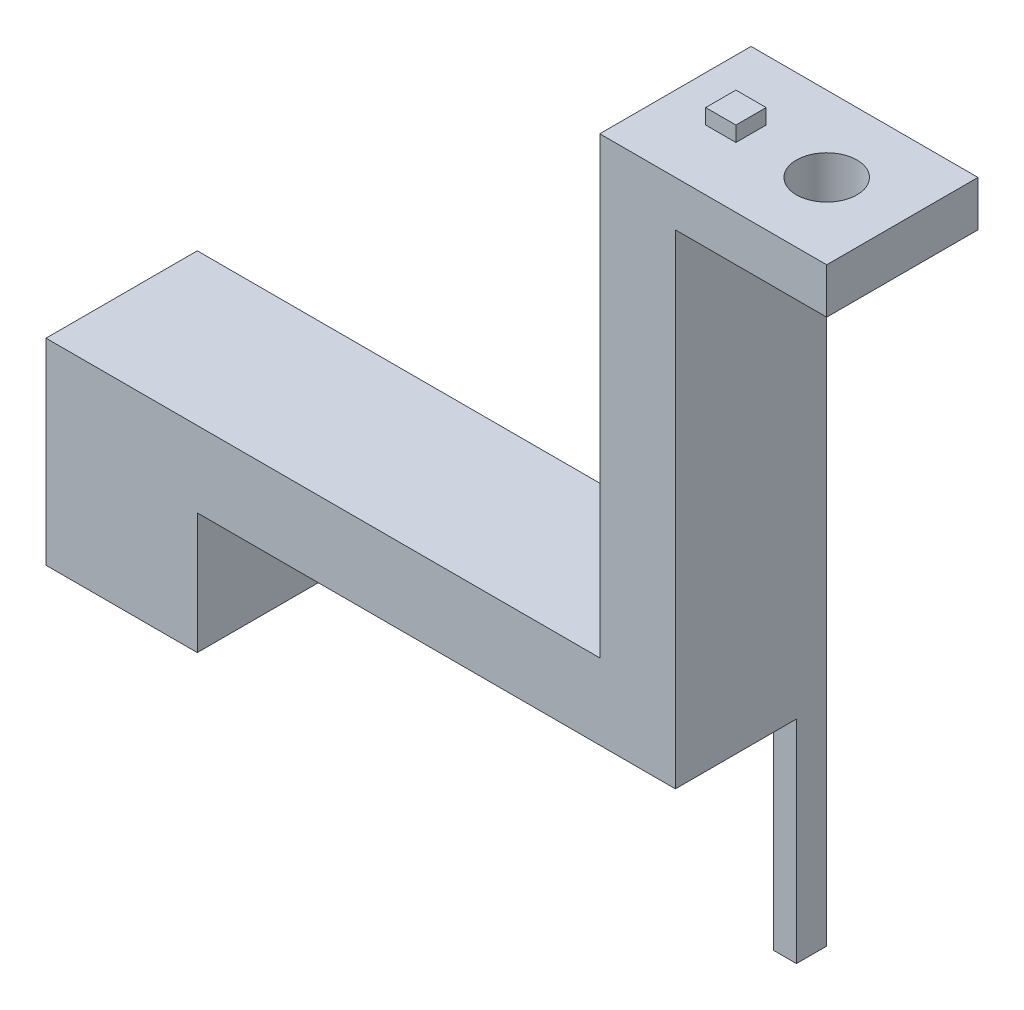
ISO-10303-21;
HEADER;
FILE_DESCRIPTION(('STEP AP214'),'2;1');
FILE_NAME('part.step','',(''),(''),'','','');
FILE_SCHEMA(('AUTOMOTIVE_DESIGN { 1 0 10303 214 1 1 1 1 }'));
ENDSEC;
DATA;
#1=APPLICATION_CONTEXT('core data for automotive mechanical design processes');
#2=APPLICATION_PROTOCOL_DEFINITION('international standard','automotive_design',2000,#1);
#3=PRODUCT_CONTEXT('',#1,'mechanical');
#4=PRODUCT('Part','Part','',(#3));
#5=PRODUCT_RELATED_PRODUCT_CATEGORY('part','',(#4));
#6=PRODUCT_DEFINITION_FORMATION('','',#4);
#7=PRODUCT_DEFINITION_CONTEXT('part definition',#1,'design');
#8=PRODUCT_DEFINITION('design','',#6,#7);
#9=PRODUCT_DEFINITION_SHAPE('','',#8);
#10=(LENGTH_UNIT() NAMED_UNIT(*) SI_UNIT(.MILLI.,.METRE.));
#11=(NAMED_UNIT(*) PLANE_ANGLE_UNIT() SI_UNIT($,.RADIAN.));
#12=(NAMED_UNIT(*) SI_UNIT($,.STERADIAN.) SOLID_ANGLE_UNIT());
#13=UNCERTAINTY_MEASURE_WITH_UNIT(LENGTH_MEASURE(1.E-05),#10,'distance_accuracy_value','');
#14=(GEOMETRIC_REPRESENTATION_CONTEXT(3) GLOBAL_UNCERTAINTY_ASSIGNED_CONTEXT((#13)) GLOBAL_UNIT_ASSIGNED_CONTEXT((#10,
#11,#12)) REPRESENTATION_CONTEXT('',''));
#15=CARTESIAN_POINT('',(0.,0.,0.));
#16=DIRECTION('',(0.,0.,1.));
#17=DIRECTION('',(1.,0.,0.));
#18=AXIS2_PLACEMENT_3D('',#15,#16,#17);
#19=CARTESIAN_POINT('',(41.6,8.,10.));
#20=DIRECTION('',(0.,1.,0.));
#21=DIRECTION('',(-1.,0.,0.));
#22=AXIS2_PLACEMENT_3D('',#19,#20,#21);
#23=PLANE('',#22);
#24=DIRECTION('',(-1.,0.,0.));
#25=VECTOR('',#24,1.);
#26=CARTESIAN_POINT('',(0.,7.99999999999999,2.));
#27=LINE('',#26,#25);
#28=CARTESIAN_POINT('',(41.6,8.,2.));
#29=VERTEX_POINT('',#28);
#30=CARTESIAN_POINT('',(40.1,8.,2.));
#31=VERTEX_POINT('',#30);
#32=EDGE_CURVE('E66',#29,#31,#27,.T.);
#33=ORIENTED_EDGE('',*,*,#32,.F.);
#34=DIRECTION('',(0.,0.,-1.));
#35=VECTOR('',#34,1.);
#36=CARTESIAN_POINT('',(41.6,8.,10.));
#37=LINE('',#36,#35);
#38=CARTESIAN_POINT('',(41.6,8.,10.));
#39=VERTEX_POINT('',#38);
#40=EDGE_CURVE('E400',#39,#29,#37,.T.);
#41=ORIENTED_EDGE('',*,*,#40,.F.);
#42=DIRECTION('',(1.,0.,0.));
#43=VECTOR('',#42,1.);
#44=CARTESIAN_POINT('',(41.6,8.,10.));
#45=LINE('',#44,#43);
#46=CARTESIAN_POINT('',(10.,8.,10.));
#47=VERTEX_POINT('',#46);
#48=EDGE_CURVE('E325',#47,#39,#45,.T.);
#49=ORIENTED_EDGE('',*,*,#48,.F.);
#50=DIRECTION('',(0.,0.,-1.));
#51=VECTOR('',#50,1.);
#52=CARTESIAN_POINT('',(10.,8.,10.));
#53=LINE('',#52,#51);
#54=CARTESIAN_POINT('',(10.,8.,0.));
#55=VERTEX_POINT('',#54);
#56=EDGE_CURVE('E403',#47,#55,#53,.T.);
#57=ORIENTED_EDGE('',*,*,#56,.T.);
#58=DIRECTION('',(1.,0.,0.));
#59=VECTOR('',#58,1.);
#60=CARTESIAN_POINT('',(41.6,8.,0.));
#61=LINE('',#60,#59);
#62=CARTESIAN_POINT('',(40.1,8.,0.));
#63=VERTEX_POINT('',#62);
#64=EDGE_CURVE('E356',#55,#63,#61,.T.);
#65=ORIENTED_EDGE('',*,*,#64,.T.);
#66=DIRECTION('',(0.,0.,-1.));
#67=VECTOR('',#66,1.);
#68=CARTESIAN_POINT('',(40.1,8.,0.));
#69=LINE('',#68,#67);
#70=EDGE_CURVE('E61',#31,#63,#69,.T.);
#71=ORIENTED_EDGE('',*,*,#70,.F.);
#72=EDGE_LOOP('',(#33,#41,#49,#57,#65,#71));
#73=FACE_BOUND('',#72,.T.);
#74=ADVANCED_FACE('F45',(#73),#23,.F.);
#75=CARTESIAN_POINT('',(0.,13.,10.));
#76=DIRECTION('',(1.,0.,0.));
#77=DIRECTION('',(0.,1.,0.));
#78=AXIS2_PLACEMENT_3D('',#75,#76,#77);
#79=PLANE('',#78);
#80=DIRECTION('',(0.,-1.,0.));
#81=VECTOR('',#80,1.);
#82=CARTESIAN_POINT('',(0.,13.,0.));
#83=LINE('',#82,#81);
#84=CARTESIAN_POINT('',(0.,13.,0.));
#85=VERTEX_POINT('',#84);
#86=CARTESIAN_POINT('',(0.,0.,0.));
#87=VERTEX_POINT('',#86);
#88=EDGE_CURVE('E304',#85,#87,#83,.T.);
#89=ORIENTED_EDGE('',*,*,#88,.T.);
#90=DIRECTION('',(0.,0.,-1.));
#91=VECTOR('',#90,1.);
#92=CARTESIAN_POINT('',(0.,0.,10.));
#93=LINE('',#92,#91);
#94=CARTESIAN_POINT('',(0.,0.,10.));
#95=VERTEX_POINT('',#94);
#96=EDGE_CURVE('E11',#95,#87,#93,.T.);
#97=ORIENTED_EDGE('',*,*,#96,.F.);
#98=DIRECTION('',(0.,-1.,0.));
#99=VECTOR('',#98,1.);
#100=CARTESIAN_POINT('',(0.,13.,10.));
#101=LINE('',#100,#99);
#102=CARTESIAN_POINT('',(0.,13.,10.));
#103=VERTEX_POINT('',#102);
#104=EDGE_CURVE('E314',#103,#95,#101,.T.);
#105=ORIENTED_EDGE('',*,*,#104,.F.);
#106=DIRECTION('',(0.,0.,-1.));
#107=VECTOR('',#106,1.);
#108=CARTESIAN_POINT('',(0.,13.,10.));
#109=LINE('',#108,#107);
#110=EDGE_CURVE('E346',#103,#85,#109,.T.);
#111=ORIENTED_EDGE('',*,*,#110,.T.);
#112=EDGE_LOOP('',(#89,#97,#105,#111));
#113=FACE_BOUND('',#112,.T.);
#114=ADVANCED_FACE('F47',(#113),#79,.F.);
#115=CARTESIAN_POINT('',(0.,0.,10.));
#116=DIRECTION('',(0.,1.,0.));
#117=DIRECTION('',(0.,0.,1.));
#118=AXIS2_PLACEMENT_3D('',#115,#116,#117);
#119=PLANE('',#118);
#120=DIRECTION('',(0.,0.,-1.));
#121=VECTOR('',#120,1.);
#122=CARTESIAN_POINT('',(7.55,0.,6.55));
#123=LINE('',#122,#121);
#124=CARTESIAN_POINT('',(7.55,0.,6.55));
#125=VERTEX_POINT('',#124);
#126=CARTESIAN_POINT('',(7.55,0.,3.45));
#127=VERTEX_POINT('',#126);
#128=EDGE_CURVE('E290',#125,#127,#123,.T.);
#129=ORIENTED_EDGE('',*,*,#128,.T.);
#130=DIRECTION('',(1.,0.,0.));
#131=VECTOR('',#130,1.);
#132=CARTESIAN_POINT('',(2.45,0.,3.45));
#133=LINE('',#132,#131);
#134=CARTESIAN_POINT('',(2.45,0.,3.45));
#135=VERTEX_POINT('',#134);
#136=EDGE_CURVE('E260',#135,#127,#133,.T.);
#137=ORIENTED_EDGE('',*,*,#136,.F.);
#138=DIRECTION('',(0.,0.,-1.));
#139=VECTOR('',#138,1.);
#140=CARTESIAN_POINT('',(2.45,0.,6.55));
#141=LINE('',#140,#139);
#142=CARTESIAN_POINT('',(2.45,0.,6.55));
#143=VERTEX_POINT('',#142);
#144=EDGE_CURVE('E277',#143,#135,#141,.T.);
#145=ORIENTED_EDGE('',*,*,#144,.F.);
#146=DIRECTION('',(1.,0.,0.));
#147=VECTOR('',#146,1.);
#148=CARTESIAN_POINT('',(2.45,0.,6.55));
#149=LINE('',#148,#147);
#150=EDGE_CURVE('E294',#143,#125,#149,.T.);
#151=ORIENTED_EDGE('',*,*,#150,.T.);
#152=EDGE_LOOP('',(#129,#137,#145,#151));
#153=FACE_BOUND('',#152,.T.);
#154=DIRECTION('',(1.,0.,0.));
#155=VECTOR('',#154,1.);
#156=CARTESIAN_POINT('',(0.,0.,0.));
#157=LINE('',#156,#155);
#158=CARTESIAN_POINT('',(10.,0.,0.));
#159=VERTEX_POINT('',#158);
#160=EDGE_CURVE('E350',#87,#159,#157,.T.);
#161=ORIENTED_EDGE('',*,*,#160,.T.);
#162=DIRECTION('',(0.,0.,-1.));
#163=VECTOR('',#162,1.);
#164=CARTESIAN_POINT('',(10.,0.,10.));
#165=LINE('',#164,#163);
#166=CARTESIAN_POINT('',(10.,0.,10.));
#167=VERTEX_POINT('',#166);
#168=EDGE_CURVE('E54',#167,#159,#165,.T.);
#169=ORIENTED_EDGE('',*,*,#168,.F.);
#170=DIRECTION('',(1.,0.,0.));
#171=VECTOR('',#170,1.);
#172=CARTESIAN_POINT('',(0.,0.,10.));
#173=LINE('',#172,#171);
#174=EDGE_CURVE('E318',#95,#167,#173,.T.);
#175=ORIENTED_EDGE('',*,*,#174,.F.);
#176=ORIENTED_EDGE('',*,*,#96,.T.);
#177=EDGE_LOOP('',(#161,#169,#175,#176));
#178=FACE_BOUND('',#177,.T.);
#179=ADVANCED_FACE('F437',(#153,#178),#119,.F.);
#180=CARTESIAN_POINT('',(10.,8.,10.));
#181=DIRECTION('',(-1.,0.,0.));
#182=DIRECTION('',(0.,-1.,0.));
#183=AXIS2_PLACEMENT_3D('',#180,#181,#182);
#184=PLANE('',#183);
#185=DIRECTION('',(0.,1.,0.));
#186=VECTOR('',#185,1.);
#187=CARTESIAN_POINT('',(10.,8.,0.));
#188=LINE('',#187,#186);
#189=EDGE_CURVE('E353',#159,#55,#188,.T.);
#190=ORIENTED_EDGE('',*,*,#189,.T.);
#191=ORIENTED_EDGE('',*,*,#56,.F.);
#192=DIRECTION('',(0.,1.,0.));
#193=VECTOR('',#192,1.);
#194=CARTESIAN_POINT('',(10.,8.,10.));
#195=LINE('',#194,#193);
#196=EDGE_CURVE('E322',#167,#47,#195,.T.);
#197=ORIENTED_EDGE('',*,*,#196,.F.);
#198=ORIENTED_EDGE('',*,*,#168,.T.);
#199=EDGE_LOOP('',(#190,#191,#197,#198));
#200=FACE_BOUND('',#199,.T.);
#201=ADVANCED_FACE('F412',(#200),#184,.F.);
#202=CARTESIAN_POINT('',(41.6,40.,10.));
#203=DIRECTION('',(-1.,0.,0.));
#204=DIRECTION('',(0.,-1.,0.));
#205=AXIS2_PLACEMENT_3D('',#202,#203,#204);
#206=PLANE('',#205);
#207=DIRECTION('',(0.,1.,0.));
#208=VECTOR('',#207,1.);
#209=CARTESIAN_POINT('',(41.6,40.,0.));
#210=LINE('',#209,#208);
#211=CARTESIAN_POINT('',(41.6,-6.,0.));
#212=VERTEX_POINT('',#211);
#213=CARTESIAN_POINT('',(41.6,40.,0.));
#214=VERTEX_POINT('',#213);
#215=EDGE_CURVE('E359',#212,#214,#210,.T.);
#216=ORIENTED_EDGE('',*,*,#215,.T.);
#217=DIRECTION('',(0.,0.,-1.));
#218=VECTOR('',#217,1.);
#219=CARTESIAN_POINT('',(41.6,40.,10.));
#220=LINE('',#219,#218);
#221=CARTESIAN_POINT('',(41.6,40.,10.));
#222=VERTEX_POINT('',#221);
#223=EDGE_CURVE('E396',#222,#214,#220,.T.);
#224=ORIENTED_EDGE('',*,*,#223,.F.);
#225=DIRECTION('',(0.,1.,0.));
#226=VECTOR('',#225,1.);
#227=CARTESIAN_POINT('',(41.6,40.,10.));
#228=LINE('',#227,#226);
#229=EDGE_CURVE('E328',#39,#222,#228,.T.);
#230=ORIENTED_EDGE('',*,*,#229,.F.);
#231=ORIENTED_EDGE('',*,*,#40,.T.);
#232=DIRECTION('',(0.,1.,0.));
#233=VECTOR('',#232,1.);
#234=CARTESIAN_POINT('',(41.6,-6.,2.));
#235=LINE('',#234,#233);
#236=CARTESIAN_POINT('',(41.6,-6.,2.));
#237=VERTEX_POINT('',#236);
#238=EDGE_CURVE('E220',#237,#29,#235,.T.);
#239=ORIENTED_EDGE('',*,*,#238,.F.);
#240=DIRECTION('',(0.,0.,1.));
#241=VECTOR('',#240,1.);
#242=CARTESIAN_POINT('',(41.6,-6.,0.));
#243=LINE('',#242,#241);
#244=EDGE_CURVE('E205',#212,#237,#243,.T.);
#245=ORIENTED_EDGE('',*,*,#244,.F.);
#246=EDGE_LOOP('',(#216,#224,#230,#231,#239,#245));
#247=FACE_BOUND('',#246,.T.);
#248=ADVANCED_FACE('F430',(#247),#206,.F.);
#249=CARTESIAN_POINT('',(41.6,40.,10.));
#250=DIRECTION('',(0.,1.,0.));
#251=DIRECTION('',(0.,0.,1.));
#252=AXIS2_PLACEMENT_3D('',#249,#250,#251);
#253=PLANE('',#252);
#254=CARTESIAN_POINT('',(46.6,40.,5.));
#255=DIRECTION('',(0.,1.,0.));
#256=DIRECTION('',(0.,0.,1.));
#257=AXIS2_PLACEMENT_3D('',#254,#255,#256);
#258=CIRCLE('',#257,2.);
#259=CARTESIAN_POINT('',(46.6,40.,7.));
#260=VERTEX_POINT('',#259);
#261=EDGE_CURVE('E218',#260,#260,#258,.F.);
#262=ORIENTED_EDGE('',*,*,#261,.F.);
#263=EDGE_LOOP('',(#262));
#264=FACE_BOUND('',#263,.T.);
#265=DIRECTION('',(1.,0.,0.));
#266=VECTOR('',#265,1.);
#267=CARTESIAN_POINT('',(41.6,40.,0.));
#268=LINE('',#267,#266);
#269=CARTESIAN_POINT('',(51.6,40.,0.));
#270=VERTEX_POINT('',#269);
#271=EDGE_CURVE('E362',#214,#270,#268,.T.);
#272=ORIENTED_EDGE('',*,*,#271,.T.);
#273=DIRECTION('',(0.,0.,-1.));
#274=VECTOR('',#273,1.);
#275=CARTESIAN_POINT('',(51.6,40.,10.));
#276=LINE('',#275,#274);
#277=CARTESIAN_POINT('',(51.6,40.,10.));
#278=VERTEX_POINT('',#277);
#279=EDGE_CURVE('E392',#278,#270,#276,.T.);
#280=ORIENTED_EDGE('',*,*,#279,.F.);
#281=DIRECTION('',(1.,0.,0.));
#282=VECTOR('',#281,1.);
#283=CARTESIAN_POINT('',(41.6,40.,10.));
#284=LINE('',#283,#282);
#285=EDGE_CURVE('E331',#222,#278,#284,.T.);
#286=ORIENTED_EDGE('',*,*,#285,.F.);
#287=ORIENTED_EDGE('',*,*,#223,.T.);
#288=EDGE_LOOP('',(#272,#280,#286,#287));
#289=FACE_BOUND('',#288,.T.);
#290=ADVANCED_FACE('F462',(#264,#289),#253,.F.);
#291=CARTESIAN_POINT('',(51.6,40.,10.));
#292=DIRECTION('',(-1.,0.,0.));
#293=DIRECTION('',(0.,0.,1.));
#294=AXIS2_PLACEMENT_3D('',#291,#292,#293);
#295=PLANE('',#294);
#296=DIRECTION('',(0.,1.,0.));
#297=VECTOR('',#296,1.);
#298=CARTESIAN_POINT('',(51.6,40.,0.));
#299=LINE('',#298,#297);
#300=CARTESIAN_POINT('',(51.6,43.,0.));
#301=VERTEX_POINT('',#300);
#302=EDGE_CURVE('E365',#270,#301,#299,.T.);
#303=ORIENTED_EDGE('',*,*,#302,.T.);
#304=DIRECTION('',(0.,0.,-1.));
#305=VECTOR('',#304,1.);
#306=CARTESIAN_POINT('',(51.6,43.,10.));
#307=LINE('',#306,#305);
#308=CARTESIAN_POINT('',(51.6,43.,10.));
#309=VERTEX_POINT('',#308);
#310=EDGE_CURVE('E388',#309,#301,#307,.T.);
#311=ORIENTED_EDGE('',*,*,#310,.F.);
#312=DIRECTION('',(0.,1.,0.));
#313=VECTOR('',#312,1.);
#314=CARTESIAN_POINT('',(51.6,40.,10.));
#315=LINE('',#314,#313);
#316=EDGE_CURVE('E334',#278,#309,#315,.T.);
#317=ORIENTED_EDGE('',*,*,#316,.F.);
#318=ORIENTED_EDGE('',*,*,#279,.T.);
#319=EDGE_LOOP('',(#303,#311,#317,#318));
#320=FACE_BOUND('',#319,.T.);
#321=ADVANCED_FACE('F458',(#320),#295,.F.);
#322=CARTESIAN_POINT('',(36.6,43.,10.));
#323=DIRECTION('',(0.,-1.,0.));
#324=DIRECTION('',(0.,0.,-1.));
#325=AXIS2_PLACEMENT_3D('',#322,#323,#324);
#326=PLANE('',#325);
#327=CARTESIAN_POINT('',(46.6,43.,5.));
#328=DIRECTION('',(0.,1.,0.));
#329=DIRECTION('',(0.,0.,1.));
#330=AXIS2_PLACEMENT_3D('',#327,#328,#329);
#331=CIRCLE('',#330,2.);
#332=CARTESIAN_POINT('',(46.6,43.,7.));
#333=VERTEX_POINT('',#332);
#334=EDGE_CURVE('E213',#333,#333,#331,.T.);
#335=ORIENTED_EDGE('',*,*,#334,.F.);
#336=EDGE_LOOP('',(#335));
#337=FACE_BOUND('',#336,.T.);
#338=DIRECTION('',(0.,0.,-1.));
#339=VECTOR('',#338,1.);
#340=CARTESIAN_POINT('',(39.6,43.,6.));
#341=LINE('',#340,#339);
#342=CARTESIAN_POINT('',(39.6,43.,6.));
#343=VERTEX_POINT('',#342);
#344=CARTESIAN_POINT('',(39.6,43.,4.));
#345=VERTEX_POINT('',#344);
#346=EDGE_CURVE('E233',#343,#345,#341,.T.);
#347=ORIENTED_EDGE('',*,*,#346,.T.);
#348=DIRECTION('',(1.,0.,0.));
#349=VECTOR('',#348,1.);
#350=CARTESIAN_POINT('',(39.6,43.,4.));
#351=LINE('',#350,#349);
#352=CARTESIAN_POINT('',(41.6,43.,4.));
#353=VERTEX_POINT('',#352);
#354=EDGE_CURVE('E227',#345,#353,#351,.T.);
#355=ORIENTED_EDGE('',*,*,#354,.T.);
#356=DIRECTION('',(0.,0.,-1.));
#357=VECTOR('',#356,1.);
#358=CARTESIAN_POINT('',(41.6,43.,6.));
#359=LINE('',#358,#357);
#360=CARTESIAN_POINT('',(41.6,43.,6.));
#361=VERTEX_POINT('',#360);
#362=EDGE_CURVE('E246',#361,#353,#359,.T.);
#363=ORIENTED_EDGE('',*,*,#362,.F.);
#364=DIRECTION('',(1.,0.,0.));
#365=VECTOR('',#364,1.);
#366=CARTESIAN_POINT('',(39.6,43.,6.));
#367=LINE('',#366,#365);
#368=EDGE_CURVE('E250',#343,#361,#367,.T.);
#369=ORIENTED_EDGE('',*,*,#368,.F.);
#370=EDGE_LOOP('',(#347,#355,#363,#369));
#371=FACE_BOUND('',#370,.T.);
#372=DIRECTION('',(-1.,0.,0.));
#373=VECTOR('',#372,1.);
#374=CARTESIAN_POINT('',(36.6,43.,0.));
#375=LINE('',#374,#373);
#376=CARTESIAN_POINT('',(36.6,43.,0.));
#377=VERTEX_POINT('',#376);
#378=EDGE_CURVE('E368',#301,#377,#375,.T.);
#379=ORIENTED_EDGE('',*,*,#378,.T.);
#380=DIRECTION('',(0.,0.,-1.));
#381=VECTOR('',#380,1.);
#382=CARTESIAN_POINT('',(36.6,43.,10.));
#383=LINE('',#382,#381);
#384=CARTESIAN_POINT('',(36.6,43.,10.));
#385=VERTEX_POINT('',#384);
#386=EDGE_CURVE('E384',#385,#377,#383,.T.);
#387=ORIENTED_EDGE('',*,*,#386,.F.);
#388=DIRECTION('',(-1.,0.,0.));
#389=VECTOR('',#388,1.);
#390=CARTESIAN_POINT('',(36.6,43.,10.));
#391=LINE('',#390,#389);
#392=EDGE_CURVE('E337',#309,#385,#391,.T.);
#393=ORIENTED_EDGE('',*,*,#392,.F.);
#394=ORIENTED_EDGE('',*,*,#310,.T.);
#395=EDGE_LOOP('',(#379,#387,#393,#394));
#396=FACE_BOUND('',#395,.T.);
#397=ADVANCED_FACE('F454',(#337,#371,#396),#326,.F.);
#398=CARTESIAN_POINT('',(36.6,13.,10.));
#399=DIRECTION('',(1.,0.,0.));
#400=DIRECTION('',(0.,0.,-1.));
#401=AXIS2_PLACEMENT_3D('',#398,#399,#400);
#402=PLANE('',#401);
#403=DIRECTION('',(0.,-1.,0.));
#404=VECTOR('',#403,1.);
#405=CARTESIAN_POINT('',(36.6,13.,0.));
#406=LINE('',#405,#404);
#407=CARTESIAN_POINT('',(36.6,13.,0.));
#408=VERTEX_POINT('',#407);
#409=EDGE_CURVE('E371',#377,#408,#406,.T.);
#410=ORIENTED_EDGE('',*,*,#409,.T.);
#411=DIRECTION('',(0.,0.,-1.));
#412=VECTOR('',#411,1.);
#413=CARTESIAN_POINT('',(36.6,13.,10.));
#414=LINE('',#413,#412);
#415=CARTESIAN_POINT('',(36.6,13.,10.));
#416=VERTEX_POINT('',#415);
#417=EDGE_CURVE('E380',#416,#408,#414,.T.);
#418=ORIENTED_EDGE('',*,*,#417,.F.);
#419=DIRECTION('',(0.,-1.,0.));
#420=VECTOR('',#419,1.);
#421=CARTESIAN_POINT('',(36.6,13.,10.));
#422=LINE('',#421,#420);
#423=EDGE_CURVE('E340',#385,#416,#422,.T.);
#424=ORIENTED_EDGE('',*,*,#423,.F.);
#425=ORIENTED_EDGE('',*,*,#386,.T.);
#426=EDGE_LOOP('',(#410,#418,#424,#425));
#427=FACE_BOUND('',#426,.T.);
#428=ADVANCED_FACE('F445',(#427),#402,.F.);
#429=CARTESIAN_POINT('',(0.,13.,10.));
#430=DIRECTION('',(0.,-1.,0.));
#431=DIRECTION('',(0.,0.,-1.));
#432=AXIS2_PLACEMENT_3D('',#429,#430,#431);
#433=PLANE('',#432);
#434=DIRECTION('',(-1.,0.,0.));
#435=VECTOR('',#434,1.);
#436=CARTESIAN_POINT('',(0.,13.,0.));
#437=LINE('',#436,#435);
#438=EDGE_CURVE('E319',#408,#85,#437,.T.);
#439=ORIENTED_EDGE('',*,*,#438,.T.);
#440=ORIENTED_EDGE('',*,*,#110,.F.);
#441=DIRECTION('',(-1.,0.,0.));
#442=VECTOR('',#441,1.);
#443=CARTESIAN_POINT('',(10.,13.,10.));
#444=LINE('',#443,#442);
#445=EDGE_CURVE('E343',#416,#103,#444,.T.);
#446=ORIENTED_EDGE('',*,*,#445,.F.);
#447=ORIENTED_EDGE('',*,*,#417,.T.);
#448=EDGE_LOOP('',(#439,#440,#446,#447));
#449=FACE_BOUND('',#448,.T.);
#450=ADVANCED_FACE('F449',(#449),#433,.F.);
#451=CARTESIAN_POINT('',(0.,0.,10.));
#452=DIRECTION('',(0.,0.,1.));
#453=DIRECTION('',(1.,0.,0.));
#454=AXIS2_PLACEMENT_3D('',#451,#452,#453);
#455=PLANE('',#454);
#456=ORIENTED_EDGE('',*,*,#104,.T.);
#457=ORIENTED_EDGE('',*,*,#174,.T.);
#458=ORIENTED_EDGE('',*,*,#196,.T.);
#459=ORIENTED_EDGE('',*,*,#48,.T.);
#460=ORIENTED_EDGE('',*,*,#229,.T.);
#461=ORIENTED_EDGE('',*,*,#285,.T.);
#462=ORIENTED_EDGE('',*,*,#316,.T.);
#463=ORIENTED_EDGE('',*,*,#392,.T.);
#464=ORIENTED_EDGE('',*,*,#423,.T.);
#465=ORIENTED_EDGE('',*,*,#445,.T.);
#466=EDGE_LOOP('',(#456,#457,#458,#459,#460,#461,#462,#463,#464,#465));
#467=FACE_BOUND('',#466,.T.);
#468=ADVANCED_FACE('F434',(#467),#455,.T.);
#469=CARTESIAN_POINT('',(0.,0.,0.));
#470=DIRECTION('',(0.,0.,1.));
#471=DIRECTION('',(1.,0.,0.));
#472=AXIS2_PLACEMENT_3D('',#469,#470,#471);
#473=PLANE('',#472);
#474=ORIENTED_EDGE('',*,*,#88,.F.);
#475=ORIENTED_EDGE('',*,*,#438,.F.);
#476=ORIENTED_EDGE('',*,*,#409,.F.);
#477=ORIENTED_EDGE('',*,*,#378,.F.);
#478=ORIENTED_EDGE('',*,*,#302,.F.);
#479=ORIENTED_EDGE('',*,*,#271,.F.);
#480=ORIENTED_EDGE('',*,*,#215,.F.);
#481=DIRECTION('',(1.,0.,0.));
#482=VECTOR('',#481,1.);
#483=CARTESIAN_POINT('',(0.,-6.00000000000001,0.));
#484=LINE('',#483,#482);
#485=CARTESIAN_POINT('',(40.1,-6.,0.));
#486=VERTEX_POINT('',#485);
#487=EDGE_CURVE('E199',#486,#212,#484,.T.);
#488=ORIENTED_EDGE('',*,*,#487,.F.);
#489=DIRECTION('',(0.,1.,0.));
#490=VECTOR('',#489,1.);
#491=CARTESIAN_POINT('',(40.1,-6.,0.));
#492=LINE('',#491,#490);
#493=EDGE_CURVE('E194',#486,#63,#492,.T.);
#494=ORIENTED_EDGE('',*,*,#493,.T.);
#495=ORIENTED_EDGE('',*,*,#64,.F.);
#496=ORIENTED_EDGE('',*,*,#189,.F.);
#497=ORIENTED_EDGE('',*,*,#160,.F.);
#498=EDGE_LOOP('',(#474,#475,#476,#477,#478,#479,#480,#488,#494,#495,#496,#497));
#499=FACE_BOUND('',#498,.T.);
#500=ADVANCED_FACE('F418',(#499),#473,.F.);
#501=CARTESIAN_POINT('',(2.45,10.,3.45));
#502=DIRECTION('',(0.,0.,-1.));
#503=DIRECTION('',(-1.,0.,0.));
#504=AXIS2_PLACEMENT_3D('',#501,#502,#503);
#505=PLANE('',#504);
#506=ORIENTED_EDGE('',*,*,#136,.T.);
#507=DIRECTION('',(0.,-1.,0.));
#508=VECTOR('',#507,1.);
#509=CARTESIAN_POINT('',(7.55,10.,3.45));
#510=LINE('',#509,#508);
#511=CARTESIAN_POINT('',(7.55,10.,3.45));
#512=VERTEX_POINT('',#511);
#513=EDGE_CURVE('E287',#512,#127,#510,.T.);
#514=ORIENTED_EDGE('',*,*,#513,.F.);
#515=DIRECTION('',(1.,0.,0.));
#516=VECTOR('',#515,1.);
#517=CARTESIAN_POINT('',(2.45,10.,3.45));
#518=LINE('',#517,#516);
#519=CARTESIAN_POINT('',(2.45,10.,3.45));
#520=VERTEX_POINT('',#519);
#521=EDGE_CURVE('E272',#520,#512,#518,.T.);
#522=ORIENTED_EDGE('',*,*,#521,.F.);
#523=DIRECTION('',(0.,-1.,0.));
#524=VECTOR('',#523,1.);
#525=CARTESIAN_POINT('',(2.45,10.,3.45));
#526=LINE('',#525,#524);
#527=EDGE_CURVE('E301',#520,#135,#526,.T.);
#528=ORIENTED_EDGE('',*,*,#527,.T.);
#529=EDGE_LOOP('',(#506,#514,#522,#528));
#530=FACE_BOUND('',#529,.T.);
#531=ADVANCED_FACE('F495',(#530),#505,.F.);
#532=CARTESIAN_POINT('',(2.45,10.,6.55));
#533=DIRECTION('',(-1.,0.,0.));
#534=DIRECTION('',(0.,0.,1.));
#535=AXIS2_PLACEMENT_3D('',#532,#533,#534);
#536=PLANE('',#535);
#537=ORIENTED_EDGE('',*,*,#144,.T.);
#538=ORIENTED_EDGE('',*,*,#527,.F.);
#539=DIRECTION('',(0.,0.,-1.));
#540=VECTOR('',#539,1.);
#541=CARTESIAN_POINT('',(2.45,10.,6.55));
#542=LINE('',#541,#540);
#543=CARTESIAN_POINT('',(2.45,10.,6.55));
#544=VERTEX_POINT('',#543);
#545=EDGE_CURVE('E283',#544,#520,#542,.T.);
#546=ORIENTED_EDGE('',*,*,#545,.F.);
#547=DIRECTION('',(0.,-1.,0.));
#548=VECTOR('',#547,1.);
#549=CARTESIAN_POINT('',(2.45,10.,6.55));
#550=LINE('',#549,#548);
#551=EDGE_CURVE('E305',#544,#143,#550,.T.);
#552=ORIENTED_EDGE('',*,*,#551,.T.);
#553=EDGE_LOOP('',(#537,#538,#546,#552));
#554=FACE_BOUND('',#553,.T.);
#555=ADVANCED_FACE('F501',(#554),#536,.F.);
#556=CARTESIAN_POINT('',(2.45,10.,6.55));
#557=DIRECTION('',(0.,0.,-1.));
#558=DIRECTION('',(-1.,0.,0.));
#559=AXIS2_PLACEMENT_3D('',#556,#557,#558);
#560=PLANE('',#559);
#561=ORIENTED_EDGE('',*,*,#150,.F.);
#562=ORIENTED_EDGE('',*,*,#551,.F.);
#563=DIRECTION('',(1.,0.,0.));
#564=VECTOR('',#563,1.);
#565=CARTESIAN_POINT('',(2.45,10.,6.55));
#566=LINE('',#565,#564);
#567=CARTESIAN_POINT('',(7.55,10.,6.55));
#568=VERTEX_POINT('',#567);
#569=EDGE_CURVE('E280',#544,#568,#566,.T.);
#570=ORIENTED_EDGE('',*,*,#569,.T.);
#571=DIRECTION('',(0.,-1.,0.));
#572=VECTOR('',#571,1.);
#573=CARTESIAN_POINT('',(7.55,10.,6.55));
#574=LINE('',#573,#572);
#575=EDGE_CURVE('E308',#568,#125,#574,.T.);
#576=ORIENTED_EDGE('',*,*,#575,.T.);
#577=EDGE_LOOP('',(#561,#562,#570,#576));
#578=FACE_BOUND('',#577,.T.);
#579=ADVANCED_FACE('F503',(#578),#560,.T.);
#580=CARTESIAN_POINT('',(7.55,10.,6.55));
#581=DIRECTION('',(-1.,0.,0.));
#582=DIRECTION('',(0.,0.,1.));
#583=AXIS2_PLACEMENT_3D('',#580,#581,#582);
#584=PLANE('',#583);
#585=ORIENTED_EDGE('',*,*,#128,.F.);
#586=ORIENTED_EDGE('',*,*,#575,.F.);
#587=DIRECTION('',(0.,0.,-1.));
#588=VECTOR('',#587,1.);
#589=CARTESIAN_POINT('',(7.55,10.,6.55));
#590=LINE('',#589,#588);
#591=EDGE_CURVE('E276',#568,#512,#590,.T.);
#592=ORIENTED_EDGE('',*,*,#591,.T.);
#593=ORIENTED_EDGE('',*,*,#513,.T.);
#594=EDGE_LOOP('',(#585,#586,#592,#593));
#595=FACE_BOUND('',#594,.T.);
#596=ADVANCED_FACE('F490',(#595),#584,.T.);
#597=CARTESIAN_POINT('',(0.,10.,0.));
#598=DIRECTION('',(0.,1.,0.));
#599=DIRECTION('',(0.,0.,1.));
#600=AXIS2_PLACEMENT_3D('',#597,#598,#599);
#601=PLANE('',#600);
#602=ORIENTED_EDGE('',*,*,#521,.T.);
#603=ORIENTED_EDGE('',*,*,#591,.F.);
#604=ORIENTED_EDGE('',*,*,#569,.F.);
#605=ORIENTED_EDGE('',*,*,#545,.T.);
#606=EDGE_LOOP('',(#602,#603,#604,#605));
#607=FACE_BOUND('',#606,.T.);
#608=ADVANCED_FACE('F497',(#607),#601,.F.);
#609=CARTESIAN_POINT('',(39.6,44.,4.));
#610=DIRECTION('',(0.,0.,-1.));
#611=DIRECTION('',(-1.,0.,0.));
#612=AXIS2_PLACEMENT_3D('',#609,#610,#611);
#613=PLANE('',#612);
#614=ORIENTED_EDGE('',*,*,#354,.F.);
#615=DIRECTION('',(0.,-1.,0.));
#616=VECTOR('',#615,1.);
#617=CARTESIAN_POINT('',(39.6,44.,4.));
#618=LINE('',#617,#616);
#619=CARTESIAN_POINT('',(39.6,44.,4.));
#620=VERTEX_POINT('',#619);
#621=EDGE_CURVE('E256',#620,#345,#618,.T.);
#622=ORIENTED_EDGE('',*,*,#621,.F.);
#623=DIRECTION('',(1.,0.,0.));
#624=VECTOR('',#623,1.);
#625=CARTESIAN_POINT('',(39.6,44.,4.));
#626=LINE('',#625,#624);
#627=CARTESIAN_POINT('',(41.6,44.,4.));
#628=VERTEX_POINT('',#627);
#629=EDGE_CURVE('E228',#620,#628,#626,.T.);
#630=ORIENTED_EDGE('',*,*,#629,.T.);
#631=DIRECTION('',(0.,-1.,0.));
#632=VECTOR('',#631,1.);
#633=CARTESIAN_POINT('',(41.6,44.,4.));
#634=LINE('',#633,#632);
#635=EDGE_CURVE('E243',#628,#353,#634,.T.);
#636=ORIENTED_EDGE('',*,*,#635,.T.);
#637=EDGE_LOOP('',(#614,#622,#630,#636));
#638=FACE_BOUND('',#637,.T.);
#639=ADVANCED_FACE('F537',(#638),#613,.T.);
#640=CARTESIAN_POINT('',(39.6,44.,6.));
#641=DIRECTION('',(-1.,0.,0.));
#642=DIRECTION('',(0.,0.,1.));
#643=AXIS2_PLACEMENT_3D('',#640,#641,#642);
#644=PLANE('',#643);
#645=ORIENTED_EDGE('',*,*,#346,.F.);
#646=DIRECTION('',(0.,-1.,0.));
#647=VECTOR('',#646,1.);
#648=CARTESIAN_POINT('',(39.6,44.,6.));
#649=LINE('',#648,#647);
#650=CARTESIAN_POINT('',(39.6,44.,6.));
#651=VERTEX_POINT('',#650);
#652=EDGE_CURVE('E261',#651,#343,#649,.T.);
#653=ORIENTED_EDGE('',*,*,#652,.F.);
#654=DIRECTION('',(0.,0.,-1.));
#655=VECTOR('',#654,1.);
#656=CARTESIAN_POINT('',(39.6,44.,6.));
#657=LINE('',#656,#655);
#658=EDGE_CURVE('E239',#651,#620,#657,.T.);
#659=ORIENTED_EDGE('',*,*,#658,.T.);
#660=ORIENTED_EDGE('',*,*,#621,.T.);
#661=EDGE_LOOP('',(#645,#653,#659,#660));
#662=FACE_BOUND('',#661,.T.);
#663=ADVANCED_FACE('F533',(#662),#644,.T.);
#664=CARTESIAN_POINT('',(39.6,44.,6.));
#665=DIRECTION('',(0.,0.,-1.));
#666=DIRECTION('',(-1.,0.,0.));
#667=AXIS2_PLACEMENT_3D('',#664,#665,#666);
#668=PLANE('',#667);
#669=ORIENTED_EDGE('',*,*,#368,.T.);
#670=DIRECTION('',(0.,-1.,0.));
#671=VECTOR('',#670,1.);
#672=CARTESIAN_POINT('',(41.6,44.,6.));
#673=LINE('',#672,#671);
#674=CARTESIAN_POINT('',(41.6,44.,6.));
#675=VERTEX_POINT('',#674);
#676=EDGE_CURVE('E265',#675,#361,#673,.T.);
#677=ORIENTED_EDGE('',*,*,#676,.F.);
#678=DIRECTION('',(1.,0.,0.));
#679=VECTOR('',#678,1.);
#680=CARTESIAN_POINT('',(39.6,44.,6.));
#681=LINE('',#680,#679);
#682=EDGE_CURVE('E236',#651,#675,#681,.T.);
#683=ORIENTED_EDGE('',*,*,#682,.F.);
#684=ORIENTED_EDGE('',*,*,#652,.T.);
#685=EDGE_LOOP('',(#669,#677,#683,#684));
#686=FACE_BOUND('',#685,.T.);
#687=ADVANCED_FACE('F544',(#686),#668,.F.);
#688=CARTESIAN_POINT('',(41.6,44.,6.));
#689=DIRECTION('',(-1.,0.,0.));
#690=DIRECTION('',(0.,0.,1.));
#691=AXIS2_PLACEMENT_3D('',#688,#689,#690);
#692=PLANE('',#691);
#693=ORIENTED_EDGE('',*,*,#362,.T.);
#694=ORIENTED_EDGE('',*,*,#635,.F.);
#695=DIRECTION('',(0.,0.,-1.));
#696=VECTOR('',#695,1.);
#697=CARTESIAN_POINT('',(41.6,44.,6.));
#698=LINE('',#697,#696);
#699=EDGE_CURVE('E232',#675,#628,#698,.T.);
#700=ORIENTED_EDGE('',*,*,#699,.F.);
#701=ORIENTED_EDGE('',*,*,#676,.T.);
#702=EDGE_LOOP('',(#693,#694,#700,#701));
#703=FACE_BOUND('',#702,.T.);
#704=ADVANCED_FACE('F541',(#703),#692,.F.);
#705=CARTESIAN_POINT('',(0.,44.,0.));
#706=DIRECTION('',(0.,1.,0.));
#707=DIRECTION('',(0.,0.,1.));
#708=AXIS2_PLACEMENT_3D('',#705,#706,#707);
#709=PLANE('',#708);
#710=ORIENTED_EDGE('',*,*,#629,.F.);
#711=ORIENTED_EDGE('',*,*,#658,.F.);
#712=ORIENTED_EDGE('',*,*,#682,.T.);
#713=ORIENTED_EDGE('',*,*,#699,.T.);
#714=EDGE_LOOP('',(#710,#711,#712,#713));
#715=FACE_BOUND('',#714,.T.);
#716=ADVANCED_FACE('F547',(#715),#709,.T.);
#717=CARTESIAN_POINT('',(46.6,-0.001000000000001,5.));
#718=DIRECTION('',(0.,1.,0.));
#719=DIRECTION('',(0.,0.,1.));
#720=AXIS2_PLACEMENT_3D('',#717,#718,#719);
#721=CYLINDRICAL_SURFACE('',#720,2.);
#722=ORIENTED_EDGE('',*,*,#334,.T.);
#723=EDGE_LOOP('',(#722));
#724=FACE_BOUND('',#723,.T.);
#725=ORIENTED_EDGE('',*,*,#261,.T.);
#726=EDGE_LOOP('',(#725));
#727=FACE_BOUND('',#726,.T.);
#728=ADVANCED_FACE('F549',(#724,#727),#721,.F.);
#729=CARTESIAN_POINT('',(0.,-6.00000000000001,2.));
#730=DIRECTION('',(0.,0.,-1.));
#731=DIRECTION('',(-1.,0.,0.));
#732=AXIS2_PLACEMENT_3D('',#729,#730,#731);
#733=PLANE('',#732);
#734=ORIENTED_EDGE('',*,*,#32,.T.);
#735=DIRECTION('',(0.,1.,0.));
#736=VECTOR('',#735,1.);
#737=CARTESIAN_POINT('',(40.1,-6.,2.));
#738=LINE('',#737,#736);
#739=CARTESIAN_POINT('',(40.1,-6.,2.));
#740=VERTEX_POINT('',#739);
#741=EDGE_CURVE('E192',#740,#31,#738,.T.);
#742=ORIENTED_EDGE('',*,*,#741,.F.);
#743=DIRECTION('',(-1.,0.,0.));
#744=VECTOR('',#743,1.);
#745=CARTESIAN_POINT('',(0.,-6.00000000000001,2.));
#746=LINE('',#745,#744);
#747=EDGE_CURVE('E200',#237,#740,#746,.T.);
#748=ORIENTED_EDGE('',*,*,#747,.F.);
#749=ORIENTED_EDGE('',*,*,#238,.T.);
#750=EDGE_LOOP('',(#734,#742,#748,#749));
#751=FACE_BOUND('',#750,.T.);
#752=ADVANCED_FACE('F211',(#751),#733,.F.);
#753=CARTESIAN_POINT('',(40.1,-6.,0.));
#754=DIRECTION('',(1.,0.,0.));
#755=DIRECTION('',(0.,1.,0.));
#756=AXIS2_PLACEMENT_3D('',#753,#754,#755);
#757=PLANE('',#756);
#758=ORIENTED_EDGE('',*,*,#70,.T.);
#759=ORIENTED_EDGE('',*,*,#493,.F.);
#760=DIRECTION('',(0.,0.,-1.));
#761=VECTOR('',#760,1.);
#762=CARTESIAN_POINT('',(40.1,-6.,0.));
#763=LINE('',#762,#761);
#764=EDGE_CURVE('E188',#740,#486,#763,.T.);
#765=ORIENTED_EDGE('',*,*,#764,.F.);
#766=ORIENTED_EDGE('',*,*,#741,.T.);
#767=EDGE_LOOP('',(#758,#759,#765,#766));
#768=FACE_BOUND('',#767,.T.);
#769=ADVANCED_FACE('F190',(#768),#757,.F.);
#770=CARTESIAN_POINT('',(0.,-6.00000000000001,0.));
#771=DIRECTION('',(0.,-1.,0.));
#772=DIRECTION('',(1.,0.,0.));
#773=AXIS2_PLACEMENT_3D('',#770,#771,#772);
#774=PLANE('',#773);
#775=ORIENTED_EDGE('',*,*,#747,.T.);
#776=ORIENTED_EDGE('',*,*,#764,.T.);
#777=ORIENTED_EDGE('',*,*,#487,.T.);
#778=ORIENTED_EDGE('',*,*,#244,.T.);
#779=EDGE_LOOP('',(#775,#776,#777,#778));
#780=FACE_BOUND('',#779,.T.);
#781=ADVANCED_FACE('F203',(#780),#774,.T.);
#782=CLOSED_SHELL('',(#74,#114,#179,#201,#248,#290,#321,#397,#428,#450,#468,#500,#531,#555,#579,
#596,#608,#639,#663,#687,#704,#716,#728,#752,#769,#781));
#783=MANIFOLD_SOLID_BREP('B2',#782);
#784=ADVANCED_BREP_SHAPE_REPRESENTATION('',(#18,#783),#14);
#785=SHAPE_DEFINITION_REPRESENTATION(#9,#784);
ENDSEC;
END-ISO-10303-21;
